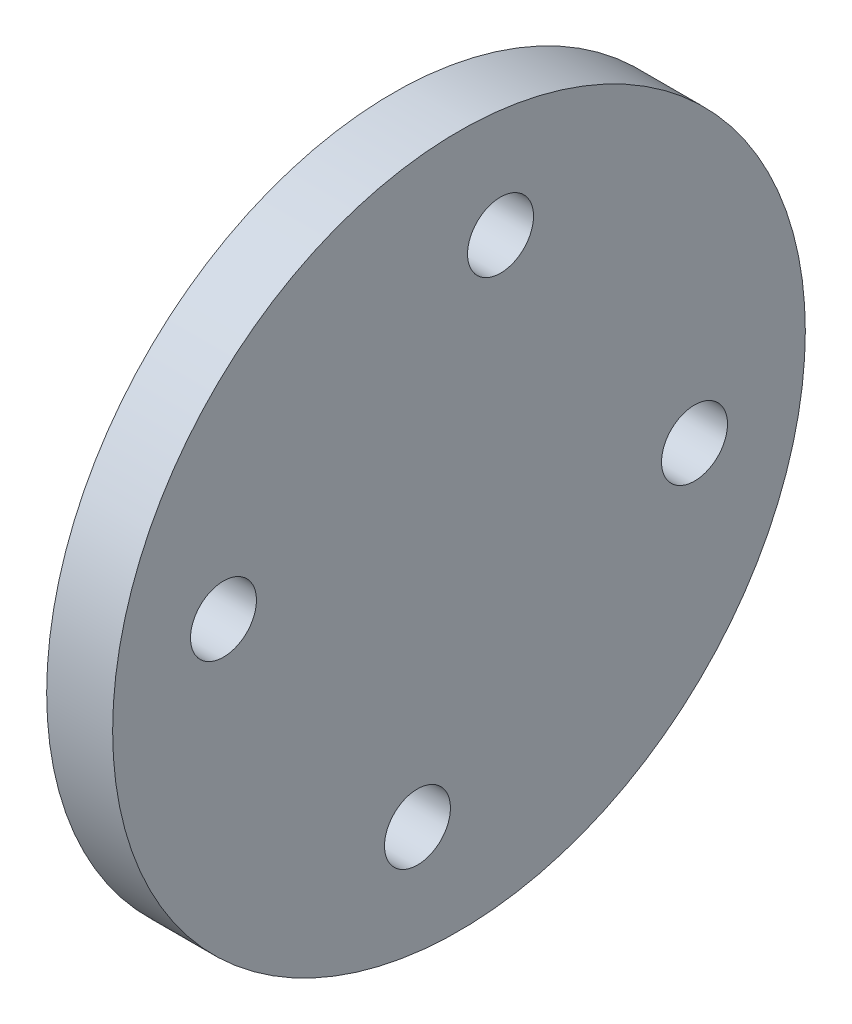
ISO-10303-21;
HEADER;
FILE_DESCRIPTION(('STEP AP214'),'2;1');
FILE_NAME('part.step','',(''),(''),'','','');
FILE_SCHEMA(('AUTOMOTIVE_DESIGN { 1 0 10303 214 1 1 1 1 }'));
ENDSEC;
DATA;
#1=APPLICATION_CONTEXT('core data for automotive mechanical design processes');
#2=APPLICATION_PROTOCOL_DEFINITION('international standard','automotive_design',2000,#1);
#3=PRODUCT_CONTEXT('',#1,'mechanical');
#4=PRODUCT('Part','Part','',(#3));
#5=PRODUCT_RELATED_PRODUCT_CATEGORY('part','',(#4));
#6=PRODUCT_DEFINITION_FORMATION('','',#4);
#7=PRODUCT_DEFINITION_CONTEXT('part definition',#1,'design');
#8=PRODUCT_DEFINITION('design','',#6,#7);
#9=PRODUCT_DEFINITION_SHAPE('','',#8);
#10=(LENGTH_UNIT() NAMED_UNIT(*) SI_UNIT(.MILLI.,.METRE.));
#11=(NAMED_UNIT(*) PLANE_ANGLE_UNIT() SI_UNIT($,.RADIAN.));
#12=(NAMED_UNIT(*) SI_UNIT($,.STERADIAN.) SOLID_ANGLE_UNIT());
#13=UNCERTAINTY_MEASURE_WITH_UNIT(LENGTH_MEASURE(1.E-05),#10,'distance_accuracy_value','');
#14=(GEOMETRIC_REPRESENTATION_CONTEXT(3) GLOBAL_UNCERTAINTY_ASSIGNED_CONTEXT((#13)) GLOBAL_UNIT_ASSIGNED_CONTEXT((#10,
#11,#12)) REPRESENTATION_CONTEXT('',''));
#15=CARTESIAN_POINT('',(0.,0.,0.));
#16=DIRECTION('',(0.,0.,1.));
#17=DIRECTION('',(1.,0.,0.));
#18=AXIS2_PLACEMENT_3D('',#15,#16,#17);
#19=CARTESIAN_POINT('',(50.,-2.35608336515724,-40.657629981637));
#20=DIRECTION('',(-1.,0.,0.));
#21=DIRECTION('',(0.,0.,1.));
#22=AXIS2_PLACEMENT_3D('',#19,#20,#21);
#23=CYLINDRICAL_SURFACE('',#22,10.5);
#24=CARTESIAN_POINT('',(50.,-2.35608336515724,-40.657629981637));
#25=DIRECTION('',(-1.,0.,0.));
#26=DIRECTION('',(0.,0.,-1.));
#27=AXIS2_PLACEMENT_3D('',#24,#25,#26);
#28=CIRCLE('',#27,10.5);
#29=CARTESIAN_POINT('',(50.,-2.35608336515724,-51.157629981637));
#30=VERTEX_POINT('',#29);
#31=EDGE_CURVE('E10',#30,#30,#28,.T.);
#32=ORIENTED_EDGE('',*,*,#31,.T.);
#33=EDGE_LOOP('',(#32));
#34=FACE_BOUND('',#33,.T.);
#35=CARTESIAN_POINT('',(48.,-2.35608336515724,-40.657629981637));
#36=DIRECTION('',(-1.,0.,0.));
#37=DIRECTION('',(0.,0.,-1.));
#38=AXIS2_PLACEMENT_3D('',#35,#36,#37);
#39=CIRCLE('',#38,10.5);
#40=CARTESIAN_POINT('',(48.,-2.35608336515724,-51.157629981637));
#41=VERTEX_POINT('',#40);
#42=EDGE_CURVE('E44',#41,#41,#39,.T.);
#43=ORIENTED_EDGE('',*,*,#42,.F.);
#44=EDGE_LOOP('',(#43));
#45=FACE_BOUND('',#44,.T.);
#46=ADVANCED_FACE('F41',(#34,#45),#23,.T.);
#47=CARTESIAN_POINT('',(50.,-2.35608336515724,-40.657629981637));
#48=DIRECTION('',(1.,0.,0.));
#49=DIRECTION('',(0.,0.,-1.));
#50=AXIS2_PLACEMENT_3D('',#47,#48,#49);
#51=PLANE('',#50);
#52=CARTESIAN_POINT('',(50.,-3.61503265324249,-47.7974861909755));
#53=DIRECTION('',(-1.,0.,0.));
#54=DIRECTION('',(0.,0.,-1.));
#55=AXIS2_PLACEMENT_3D('',#52,#53,#54);
#56=CIRCLE('',#55,0.999999999999997);
#57=CARTESIAN_POINT('',(50.,-3.61503265324249,-48.7974861909755));
#58=VERTEX_POINT('',#57);
#59=EDGE_CURVE('E75',#58,#58,#56,.T.);
#60=ORIENTED_EDGE('',*,*,#59,.T.);
#61=EDGE_LOOP('',(#60));
#62=FACE_BOUND('',#61,.T.);
#63=CARTESIAN_POINT('',(50.,-1.097134077072,-33.5177737722985));
#64=DIRECTION('',(-1.,0.,0.));
#65=DIRECTION('',(0.,0.,-1.));
#66=AXIS2_PLACEMENT_3D('',#63,#64,#65);
#67=CIRCLE('',#66,0.999999999999997);
#68=CARTESIAN_POINT('',(50.,-1.097134077072,-34.5177737722985));
#69=VERTEX_POINT('',#68);
#70=EDGE_CURVE('E67',#69,#69,#67,.T.);
#71=ORIENTED_EDGE('',*,*,#70,.T.);
#72=EDGE_LOOP('',(#71));
#73=FACE_BOUND('',#72,.T.);
#74=CARTESIAN_POINT('',(50.,-9.49593957449575,-39.3986806935517));
#75=DIRECTION('',(-1.,0.,0.));
#76=DIRECTION('',(0.,0.,-1.));
#77=AXIS2_PLACEMENT_3D('',#74,#75,#76);
#78=CIRCLE('',#77,0.999999999999997);
#79=CARTESIAN_POINT('',(50.,-9.49593957449575,-40.3986806935517));
#80=VERTEX_POINT('',#79);
#81=EDGE_CURVE('E59',#80,#80,#78,.T.);
#82=ORIENTED_EDGE('',*,*,#81,.T.);
#83=EDGE_LOOP('',(#82));
#84=FACE_BOUND('',#83,.T.);
#85=CARTESIAN_POINT('',(50.,4.78377284418126,-41.9165792697222));
#86=DIRECTION('',(-1.,0.,0.));
#87=DIRECTION('',(0.,0.,-1.));
#88=AXIS2_PLACEMENT_3D('',#85,#86,#87);
#89=CIRCLE('',#88,0.999999999999997);
#90=CARTESIAN_POINT('',(50.,4.78377284418126,-42.9165792697222));
#91=VERTEX_POINT('',#90);
#92=EDGE_CURVE('E53',#91,#91,#89,.T.);
#93=ORIENTED_EDGE('',*,*,#92,.T.);
#94=EDGE_LOOP('',(#93));
#95=FACE_BOUND('',#94,.T.);
#96=ORIENTED_EDGE('',*,*,#31,.F.);
#97=EDGE_LOOP('',(#96));
#98=FACE_BOUND('',#97,.T.);
#99=ADVANCED_FACE('F87',(#62,#73,#84,#95,#98),#51,.T.);
#100=CARTESIAN_POINT('',(48.,-2.35608336515724,-40.657629981637));
#101=DIRECTION('',(1.,0.,0.));
#102=DIRECTION('',(0.,0.,-1.));
#103=AXIS2_PLACEMENT_3D('',#100,#101,#102);
#104=PLANE('',#103);
#105=CARTESIAN_POINT('',(48.,-3.61503265324249,-47.7974861909755));
#106=DIRECTION('',(-1.,0.,0.));
#107=DIRECTION('',(0.,0.,-1.));
#108=AXIS2_PLACEMENT_3D('',#105,#106,#107);
#109=CIRCLE('',#108,0.999999999999997);
#110=CARTESIAN_POINT('',(48.,-3.61503265324249,-48.7974861909755));
#111=VERTEX_POINT('',#110);
#112=EDGE_CURVE('E79',#111,#111,#109,.T.);
#113=ORIENTED_EDGE('',*,*,#112,.F.);
#114=EDGE_LOOP('',(#113));
#115=FACE_BOUND('',#114,.T.);
#116=CARTESIAN_POINT('',(48.,-1.097134077072,-33.5177737722985));
#117=DIRECTION('',(-1.,0.,0.));
#118=DIRECTION('',(0.,0.,-1.));
#119=AXIS2_PLACEMENT_3D('',#116,#117,#118);
#120=CIRCLE('',#119,0.999999999999997);
#121=CARTESIAN_POINT('',(48.,-1.097134077072,-34.5177737722985));
#122=VERTEX_POINT('',#121);
#123=EDGE_CURVE('E71',#122,#122,#120,.T.);
#124=ORIENTED_EDGE('',*,*,#123,.F.);
#125=EDGE_LOOP('',(#124));
#126=FACE_BOUND('',#125,.T.);
#127=CARTESIAN_POINT('',(48.,-9.49593957449575,-39.3986806935517));
#128=DIRECTION('',(-1.,0.,0.));
#129=DIRECTION('',(0.,0.,-1.));
#130=AXIS2_PLACEMENT_3D('',#127,#128,#129);
#131=CIRCLE('',#130,0.999999999999997);
#132=CARTESIAN_POINT('',(48.,-9.49593957449575,-40.3986806935517));
#133=VERTEX_POINT('',#132);
#134=EDGE_CURVE('E63',#133,#133,#131,.T.);
#135=ORIENTED_EDGE('',*,*,#134,.F.);
#136=EDGE_LOOP('',(#135));
#137=FACE_BOUND('',#136,.T.);
#138=CARTESIAN_POINT('',(48.,4.78377284418126,-41.9165792697222));
#139=DIRECTION('',(-1.,0.,0.));
#140=DIRECTION('',(0.,0.,-1.));
#141=AXIS2_PLACEMENT_3D('',#138,#139,#140);
#142=CIRCLE('',#141,0.999999999999997);
#143=CARTESIAN_POINT('',(48.,4.78377284418126,-42.9165792697222));
#144=VERTEX_POINT('',#143);
#145=EDGE_CURVE('E55',#144,#144,#142,.T.);
#146=ORIENTED_EDGE('',*,*,#145,.F.);
#147=EDGE_LOOP('',(#146));
#148=FACE_BOUND('',#147,.T.);
#149=ORIENTED_EDGE('',*,*,#42,.T.);
#150=EDGE_LOOP('',(#149));
#151=FACE_BOUND('',#150,.T.);
#152=ADVANCED_FACE('F97',(#115,#126,#137,#148,#151),#104,.F.);
#153=CARTESIAN_POINT('',(50.,4.78377284418126,-41.9165792697222));
#154=DIRECTION('',(-1.,0.,0.));
#155=DIRECTION('',(0.,0.,1.));
#156=AXIS2_PLACEMENT_3D('',#153,#154,#155);
#157=CYLINDRICAL_SURFACE('',#156,0.999999999999997);
#158=ORIENTED_EDGE('',*,*,#92,.F.);
#159=EDGE_LOOP('',(#158));
#160=FACE_BOUND('',#159,.T.);
#161=ORIENTED_EDGE('',*,*,#145,.T.);
#162=EDGE_LOOP('',(#161));
#163=FACE_BOUND('',#162,.T.);
#164=ADVANCED_FACE('F100',(#160,#163),#157,.F.);
#165=CARTESIAN_POINT('',(50.,-9.49593957449575,-39.3986806935517));
#166=DIRECTION('',(-1.,0.,0.));
#167=DIRECTION('',(0.,0.,1.));
#168=AXIS2_PLACEMENT_3D('',#165,#166,#167);
#169=CYLINDRICAL_SURFACE('',#168,0.999999999999997);
#170=ORIENTED_EDGE('',*,*,#81,.F.);
#171=EDGE_LOOP('',(#170));
#172=FACE_BOUND('',#171,.T.);
#173=ORIENTED_EDGE('',*,*,#134,.T.);
#174=EDGE_LOOP('',(#173));
#175=FACE_BOUND('',#174,.T.);
#176=ADVANCED_FACE('F119',(#172,#175),#169,.F.);
#177=CARTESIAN_POINT('',(50.,-1.097134077072,-33.5177737722985));
#178=DIRECTION('',(-1.,0.,0.));
#179=DIRECTION('',(0.,0.,1.));
#180=AXIS2_PLACEMENT_3D('',#177,#178,#179);
#181=CYLINDRICAL_SURFACE('',#180,0.999999999999997);
#182=ORIENTED_EDGE('',*,*,#70,.F.);
#183=EDGE_LOOP('',(#182));
#184=FACE_BOUND('',#183,.T.);
#185=ORIENTED_EDGE('',*,*,#123,.T.);
#186=EDGE_LOOP('',(#185));
#187=FACE_BOUND('',#186,.T.);
#188=ADVANCED_FACE('F93',(#184,#187),#181,.F.);
#189=CARTESIAN_POINT('',(50.,-3.61503265324249,-47.7974861909755));
#190=DIRECTION('',(-1.,0.,0.));
#191=DIRECTION('',(0.,0.,1.));
#192=AXIS2_PLACEMENT_3D('',#189,#190,#191);
#193=CYLINDRICAL_SURFACE('',#192,0.999999999999997);
#194=ORIENTED_EDGE('',*,*,#59,.F.);
#195=EDGE_LOOP('',(#194));
#196=FACE_BOUND('',#195,.T.);
#197=ORIENTED_EDGE('',*,*,#112,.T.);
#198=EDGE_LOOP('',(#197));
#199=FACE_BOUND('',#198,.T.);
#200=ADVANCED_FACE('F90',(#196,#199),#193,.F.);
#201=CLOSED_SHELL('',(#46,#99,#152,#164,#176,#188,#200));
#202=MANIFOLD_SOLID_BREP('B2',#201);
#203=ADVANCED_BREP_SHAPE_REPRESENTATION('',(#18,#202),#14);
#204=SHAPE_DEFINITION_REPRESENTATION(#9,#203);
ENDSEC;
END-ISO-10303-21;
